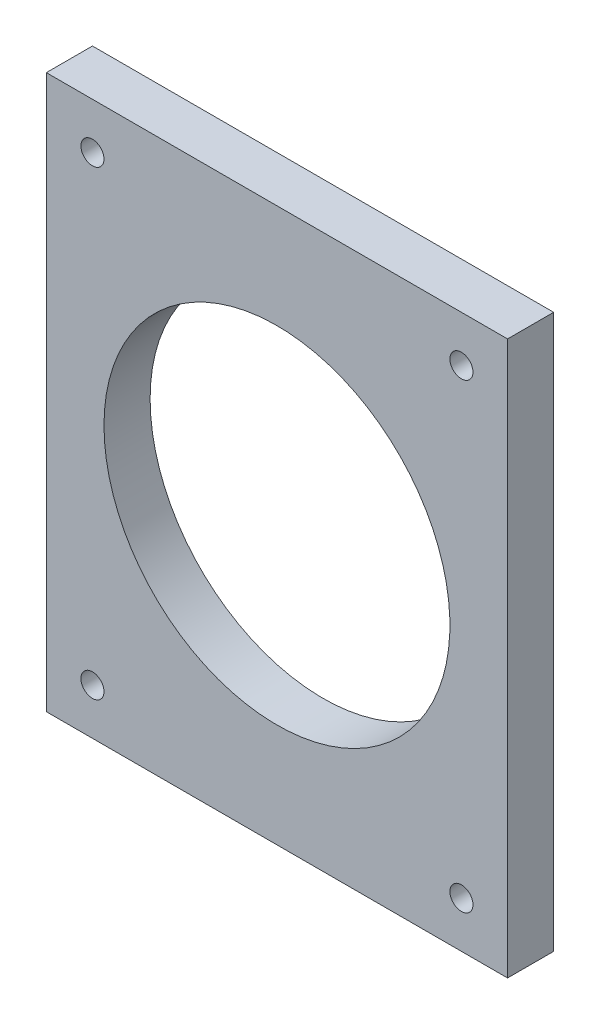
ISO-10303-21;
HEADER;
FILE_DESCRIPTION(('STEP AP214'),'2;1');
FILE_NAME('part.step','',(''),(''),'','','');
FILE_SCHEMA(('AUTOMOTIVE_DESIGN { 1 0 10303 214 1 1 1 1 }'));
ENDSEC;
DATA;
#1=APPLICATION_CONTEXT('core data for automotive mechanical design processes');
#2=APPLICATION_PROTOCOL_DEFINITION('international standard','automotive_design',2000,#1);
#3=PRODUCT_CONTEXT('',#1,'mechanical');
#4=PRODUCT('Part','Part','',(#3));
#5=PRODUCT_RELATED_PRODUCT_CATEGORY('part','',(#4));
#6=PRODUCT_DEFINITION_FORMATION('','',#4);
#7=PRODUCT_DEFINITION_CONTEXT('part definition',#1,'design');
#8=PRODUCT_DEFINITION('design','',#6,#7);
#9=PRODUCT_DEFINITION_SHAPE('','',#8);
#10=(LENGTH_UNIT() NAMED_UNIT(*) SI_UNIT(.MILLI.,.METRE.));
#11=(NAMED_UNIT(*) PLANE_ANGLE_UNIT() SI_UNIT($,.RADIAN.));
#12=(NAMED_UNIT(*) SI_UNIT($,.STERADIAN.) SOLID_ANGLE_UNIT());
#13=UNCERTAINTY_MEASURE_WITH_UNIT(LENGTH_MEASURE(1.E-05),#10,'distance_accuracy_value','');
#14=(GEOMETRIC_REPRESENTATION_CONTEXT(3) GLOBAL_UNCERTAINTY_ASSIGNED_CONTEXT((#13)) GLOBAL_UNIT_ASSIGNED_CONTEXT((#10,
#11,#12)) REPRESENTATION_CONTEXT('',''));
#15=CARTESIAN_POINT('',(0.,0.,0.));
#16=DIRECTION('',(0.,0.,1.));
#17=DIRECTION('',(1.,0.,0.));
#18=AXIS2_PLACEMENT_3D('',#15,#16,#17);
#19=CARTESIAN_POINT('',(-63.4999999999999,-76.1999999999999,12.6999999999999));
#20=DIRECTION('',(1.,0.,0.));
#21=DIRECTION('',(0.,0.,-1.));
#22=AXIS2_PLACEMENT_3D('',#19,#20,#21);
#23=PLANE('',#22);
#24=DIRECTION('',(0.,-1.,0.));
#25=VECTOR('',#24,1.);
#26=CARTESIAN_POINT('',(-63.5000000000001,-76.2,-1.38777878078145E-13));
#27=LINE('',#26,#25);
#28=CARTESIAN_POINT('',(-63.4999999999999,76.2,0.));
#29=VERTEX_POINT('',#28);
#30=CARTESIAN_POINT('',(-63.5000000000001,-76.2,-1.38777878078145E-13));
#31=VERTEX_POINT('',#30);
#32=EDGE_CURVE('E100',#29,#31,#27,.T.);
#33=ORIENTED_EDGE('',*,*,#32,.T.);
#34=DIRECTION('',(0.,0.,-1.));
#35=VECTOR('',#34,1.);
#36=CARTESIAN_POINT('',(-63.4999999999999,-76.1999999999999,12.6999999999999));
#37=LINE('',#36,#35);
#38=CARTESIAN_POINT('',(-63.4999999999999,-76.1999999999999,12.6999999999999));
#39=VERTEX_POINT('',#38);
#40=EDGE_CURVE('E11',#39,#31,#37,.T.);
#41=ORIENTED_EDGE('',*,*,#40,.F.);
#42=DIRECTION('',(0.,-1.,0.));
#43=VECTOR('',#42,1.);
#44=CARTESIAN_POINT('',(-63.4999999999999,-76.1999999999999,12.6999999999999));
#45=LINE('',#44,#43);
#46=CARTESIAN_POINT('',(-63.4999999999999,76.2,12.7));
#47=VERTEX_POINT('',#46);
#48=EDGE_CURVE('E87',#47,#39,#45,.T.);
#49=ORIENTED_EDGE('',*,*,#48,.F.);
#50=DIRECTION('',(0.,0.,-1.));
#51=VECTOR('',#50,1.);
#52=CARTESIAN_POINT('',(-63.4999999999999,76.2,12.7));
#53=LINE('',#52,#51);
#54=EDGE_CURVE('E96',#47,#29,#53,.T.);
#55=ORIENTED_EDGE('',*,*,#54,.T.);
#56=EDGE_LOOP('',(#33,#41,#49,#55));
#57=FACE_BOUND('',#56,.T.);
#58=ADVANCED_FACE('F34',(#57),#23,.F.);
#59=CARTESIAN_POINT('',(63.5,-76.2,12.7));
#60=DIRECTION('',(0.,1.,0.));
#61=DIRECTION('',(0.,0.,1.));
#62=AXIS2_PLACEMENT_3D('',#59,#60,#61);
#63=PLANE('',#62);
#64=DIRECTION('',(1.,0.,0.));
#65=VECTOR('',#64,1.);
#66=CARTESIAN_POINT('',(63.5,-76.2,0.));
#67=LINE('',#66,#65);
#68=CARTESIAN_POINT('',(63.5,-76.2,0.));
#69=VERTEX_POINT('',#68);
#70=EDGE_CURVE('E91',#31,#69,#67,.T.);
#71=ORIENTED_EDGE('',*,*,#70,.T.);
#72=DIRECTION('',(0.,0.,-1.));
#73=VECTOR('',#72,1.);
#74=CARTESIAN_POINT('',(63.5,-76.2,12.7));
#75=LINE('',#74,#73);
#76=CARTESIAN_POINT('',(63.5,-76.2,12.7));
#77=VERTEX_POINT('',#76);
#78=EDGE_CURVE('E43',#77,#69,#75,.T.);
#79=ORIENTED_EDGE('',*,*,#78,.F.);
#80=DIRECTION('',(1.,0.,0.));
#81=VECTOR('',#80,1.);
#82=CARTESIAN_POINT('',(63.5,-76.2,12.7));
#83=LINE('',#82,#81);
#84=EDGE_CURVE('E82',#39,#77,#83,.T.);
#85=ORIENTED_EDGE('',*,*,#84,.F.);
#86=ORIENTED_EDGE('',*,*,#40,.T.);
#87=EDGE_LOOP('',(#71,#79,#85,#86));
#88=FACE_BOUND('',#87,.T.);
#89=ADVANCED_FACE('F90',(#88),#63,.F.);
#90=CARTESIAN_POINT('',(63.5,-76.2,12.7));
#91=DIRECTION('',(-1.,0.,0.));
#92=DIRECTION('',(0.,0.,1.));
#93=AXIS2_PLACEMENT_3D('',#90,#91,#92);
#94=PLANE('',#93);
#95=DIRECTION('',(0.,1.,0.));
#96=VECTOR('',#95,1.);
#97=CARTESIAN_POINT('',(63.5,-76.2,0.));
#98=LINE('',#97,#96);
#99=CARTESIAN_POINT('',(63.5,76.2,0.));
#100=VERTEX_POINT('',#99);
#101=EDGE_CURVE('E69',#69,#100,#98,.T.);
#102=ORIENTED_EDGE('',*,*,#101,.T.);
#103=DIRECTION('',(0.,0.,-1.));
#104=VECTOR('',#103,1.);
#105=CARTESIAN_POINT('',(63.5,76.2,12.7));
#106=LINE('',#105,#104);
#107=CARTESIAN_POINT('',(63.5,76.2,12.7));
#108=VERTEX_POINT('',#107);
#109=EDGE_CURVE('E92',#108,#100,#106,.T.);
#110=ORIENTED_EDGE('',*,*,#109,.F.);
#111=DIRECTION('',(0.,1.,0.));
#112=VECTOR('',#111,1.);
#113=CARTESIAN_POINT('',(63.5,-76.2,12.7));
#114=LINE('',#113,#112);
#115=EDGE_CURVE('E85',#77,#108,#114,.T.);
#116=ORIENTED_EDGE('',*,*,#115,.F.);
#117=ORIENTED_EDGE('',*,*,#78,.T.);
#118=EDGE_LOOP('',(#102,#110,#116,#117));
#119=FACE_BOUND('',#118,.T.);
#120=ADVANCED_FACE('F94',(#119),#94,.F.);
#121=CARTESIAN_POINT('',(63.5,76.2,12.7));
#122=DIRECTION('',(0.,-1.,0.));
#123=DIRECTION('',(0.,0.,-1.));
#124=AXIS2_PLACEMENT_3D('',#121,#122,#123);
#125=PLANE('',#124);
#126=DIRECTION('',(-1.,0.,0.));
#127=VECTOR('',#126,1.);
#128=CARTESIAN_POINT('',(63.5,76.2,0.));
#129=LINE('',#128,#127);
#130=EDGE_CURVE('E75',#100,#29,#129,.T.);
#131=ORIENTED_EDGE('',*,*,#130,.T.);
#132=ORIENTED_EDGE('',*,*,#54,.F.);
#133=DIRECTION('',(-1.,0.,0.));
#134=VECTOR('',#133,1.);
#135=CARTESIAN_POINT('',(63.5,76.2,12.7));
#136=LINE('',#135,#134);
#137=EDGE_CURVE('E52',#108,#47,#136,.T.);
#138=ORIENTED_EDGE('',*,*,#137,.F.);
#139=ORIENTED_EDGE('',*,*,#109,.T.);
#140=EDGE_LOOP('',(#131,#132,#138,#139));
#141=FACE_BOUND('',#140,.T.);
#142=ADVANCED_FACE('F162',(#141),#125,.F.);
#143=CARTESIAN_POINT('',(0.,0.,12.7));
#144=DIRECTION('',(0.,0.,1.));
#145=DIRECTION('',(1.,0.,0.));
#146=AXIS2_PLACEMENT_3D('',#143,#144,#145);
#147=PLANE('',#146);
#148=CARTESIAN_POINT('',(50.8000000000001,-63.5,12.7));
#149=DIRECTION('',(0.,0.,-1.));
#150=DIRECTION('',(-1.,0.,0.));
#151=AXIS2_PLACEMENT_3D('',#148,#149,#150);
#152=CIRCLE('',#151,3.175);
#153=CARTESIAN_POINT('',(47.6250000000001,-63.5,12.7));
#154=VERTEX_POINT('',#153);
#155=EDGE_CURVE('E133',#154,#154,#152,.T.);
#156=ORIENTED_EDGE('',*,*,#155,.T.);
#157=EDGE_LOOP('',(#156));
#158=FACE_BOUND('',#157,.T.);
#159=CARTESIAN_POINT('',(-50.8,-63.5,12.7));
#160=DIRECTION('',(0.,0.,-1.));
#161=DIRECTION('',(-1.,0.,0.));
#162=AXIS2_PLACEMENT_3D('',#159,#160,#161);
#163=CIRCLE('',#162,3.175);
#164=CARTESIAN_POINT('',(-53.975,-63.5,12.7));
#165=VERTEX_POINT('',#164);
#166=EDGE_CURVE('E136',#165,#165,#163,.T.);
#167=ORIENTED_EDGE('',*,*,#166,.T.);
#168=EDGE_LOOP('',(#167));
#169=FACE_BOUND('',#168,.T.);
#170=CARTESIAN_POINT('',(-50.8,63.5,12.7));
#171=DIRECTION('',(0.,0.,-1.));
#172=DIRECTION('',(-1.,0.,0.));
#173=AXIS2_PLACEMENT_3D('',#170,#171,#172);
#174=CIRCLE('',#173,3.175);
#175=CARTESIAN_POINT('',(-53.975,63.5,12.7));
#176=VERTEX_POINT('',#175);
#177=EDGE_CURVE('E132',#176,#176,#174,.T.);
#178=ORIENTED_EDGE('',*,*,#177,.T.);
#179=EDGE_LOOP('',(#178));
#180=FACE_BOUND('',#179,.T.);
#181=CARTESIAN_POINT('',(50.8000000000001,63.5,12.7));
#182=DIRECTION('',(0.,0.,-1.));
#183=DIRECTION('',(-1.,0.,0.));
#184=AXIS2_PLACEMENT_3D('',#181,#182,#183);
#185=CIRCLE('',#184,3.175);
#186=CARTESIAN_POINT('',(47.6250000000001,63.5,12.7));
#187=VERTEX_POINT('',#186);
#188=EDGE_CURVE('E113',#187,#187,#185,.T.);
#189=ORIENTED_EDGE('',*,*,#188,.T.);
#190=EDGE_LOOP('',(#189));
#191=FACE_BOUND('',#190,.T.);
#192=CARTESIAN_POINT('',(0.,0.,12.7));
#193=DIRECTION('',(0.,0.,-1.));
#194=DIRECTION('',(-1.,0.,0.));
#195=AXIS2_PLACEMENT_3D('',#192,#193,#194);
#196=CIRCLE('',#195,47.625);
#197=CARTESIAN_POINT('',(-47.625,0.,12.7));
#198=VERTEX_POINT('',#197);
#199=EDGE_CURVE('E103',#198,#198,#196,.T.);
#200=ORIENTED_EDGE('',*,*,#199,.T.);
#201=EDGE_LOOP('',(#200));
#202=FACE_BOUND('',#201,.T.);
#203=ORIENTED_EDGE('',*,*,#48,.T.);
#204=ORIENTED_EDGE('',*,*,#84,.T.);
#205=ORIENTED_EDGE('',*,*,#115,.T.);
#206=ORIENTED_EDGE('',*,*,#137,.T.);
#207=EDGE_LOOP('',(#203,#204,#205,#206));
#208=FACE_BOUND('',#207,.T.);
#209=ADVANCED_FACE('F83',(#158,#169,#180,#191,#202,#208),#147,.T.);
#210=CARTESIAN_POINT('',(0.,0.,0.));
#211=DIRECTION('',(0.,0.,1.));
#212=DIRECTION('',(1.,0.,0.));
#213=AXIS2_PLACEMENT_3D('',#210,#211,#212);
#214=PLANE('',#213);
#215=CARTESIAN_POINT('',(50.8000000000001,-63.5,0.));
#216=DIRECTION('',(0.,0.,1.));
#217=DIRECTION('',(1.,0.,0.));
#218=AXIS2_PLACEMENT_3D('',#215,#216,#217);
#219=CIRCLE('',#218,3.175);
#220=CARTESIAN_POINT('',(53.9750000000001,-63.5,0.));
#221=VERTEX_POINT('',#220);
#222=EDGE_CURVE('E37',#221,#221,#219,.T.);
#223=ORIENTED_EDGE('',*,*,#222,.T.);
#224=EDGE_LOOP('',(#223));
#225=FACE_BOUND('',#224,.T.);
#226=CARTESIAN_POINT('',(-50.8,-63.5,0.));
#227=DIRECTION('',(0.,0.,1.));
#228=DIRECTION('',(1.,0.,0.));
#229=AXIS2_PLACEMENT_3D('',#226,#227,#228);
#230=CIRCLE('',#229,3.175);
#231=CARTESIAN_POINT('',(-47.625,-63.5,0.));
#232=VERTEX_POINT('',#231);
#233=EDGE_CURVE('E115',#232,#232,#230,.T.);
#234=ORIENTED_EDGE('',*,*,#233,.T.);
#235=EDGE_LOOP('',(#234));
#236=FACE_BOUND('',#235,.T.);
#237=CARTESIAN_POINT('',(-50.8,63.5,0.));
#238=DIRECTION('',(0.,0.,1.));
#239=DIRECTION('',(1.,0.,0.));
#240=AXIS2_PLACEMENT_3D('',#237,#238,#239);
#241=CIRCLE('',#240,3.175);
#242=CARTESIAN_POINT('',(-47.625,63.5,0.));
#243=VERTEX_POINT('',#242);
#244=EDGE_CURVE('E112',#243,#243,#241,.T.);
#245=ORIENTED_EDGE('',*,*,#244,.T.);
#246=EDGE_LOOP('',(#245));
#247=FACE_BOUND('',#246,.T.);
#248=CARTESIAN_POINT('',(50.8000000000001,63.5,0.));
#249=DIRECTION('',(0.,0.,1.));
#250=DIRECTION('',(1.,0.,0.));
#251=AXIS2_PLACEMENT_3D('',#248,#249,#250);
#252=CIRCLE('',#251,3.175);
#253=CARTESIAN_POINT('',(53.9750000000001,63.5,0.));
#254=VERTEX_POINT('',#253);
#255=EDGE_CURVE('E109',#254,#254,#252,.T.);
#256=ORIENTED_EDGE('',*,*,#255,.T.);
#257=EDGE_LOOP('',(#256));
#258=FACE_BOUND('',#257,.T.);
#259=CARTESIAN_POINT('',(0.,0.,0.));
#260=DIRECTION('',(0.,0.,-1.));
#261=DIRECTION('',(-1.,0.,0.));
#262=AXIS2_PLACEMENT_3D('',#259,#260,#261);
#263=CIRCLE('',#262,47.625);
#264=CARTESIAN_POINT('',(-47.625,0.,0.));
#265=VERTEX_POINT('',#264);
#266=EDGE_CURVE('E120',#265,#265,#263,.T.);
#267=ORIENTED_EDGE('',*,*,#266,.F.);
#268=EDGE_LOOP('',(#267));
#269=FACE_BOUND('',#268,.T.);
#270=ORIENTED_EDGE('',*,*,#32,.F.);
#271=ORIENTED_EDGE('',*,*,#130,.F.);
#272=ORIENTED_EDGE('',*,*,#101,.F.);
#273=ORIENTED_EDGE('',*,*,#70,.F.);
#274=EDGE_LOOP('',(#270,#271,#272,#273));
#275=FACE_BOUND('',#274,.T.);
#276=ADVANCED_FACE('F152',(#225,#236,#247,#258,#269,#275),#214,.F.);
#277=CARTESIAN_POINT('',(0.,0.,12.7));
#278=DIRECTION('',(0.,0.,-1.));
#279=DIRECTION('',(-1.,0.,0.));
#280=AXIS2_PLACEMENT_3D('',#277,#278,#279);
#281=CYLINDRICAL_SURFACE('',#280,47.625);
#282=ORIENTED_EDGE('',*,*,#199,.F.);
#283=EDGE_LOOP('',(#282));
#284=FACE_BOUND('',#283,.T.);
#285=ORIENTED_EDGE('',*,*,#266,.T.);
#286=EDGE_LOOP('',(#285));
#287=FACE_BOUND('',#286,.T.);
#288=ADVANCED_FACE('F155',(#284,#287),#281,.F.);
#289=CARTESIAN_POINT('',(50.8000000000001,63.5,12.7));
#290=DIRECTION('',(0.,0.,-1.));
#291=DIRECTION('',(-1.,0.,0.));
#292=AXIS2_PLACEMENT_3D('',#289,#290,#291);
#293=CYLINDRICAL_SURFACE('',#292,3.175);
#294=ORIENTED_EDGE('',*,*,#188,.F.);
#295=EDGE_LOOP('',(#294));
#296=FACE_BOUND('',#295,.T.);
#297=ORIENTED_EDGE('',*,*,#255,.F.);
#298=EDGE_LOOP('',(#297));
#299=FACE_BOUND('',#298,.T.);
#300=ADVANCED_FACE('F148',(#296,#299),#293,.F.);
#301=CARTESIAN_POINT('',(-50.8,63.5,12.7));
#302=DIRECTION('',(0.,0.,-1.));
#303=DIRECTION('',(-1.,0.,0.));
#304=AXIS2_PLACEMENT_3D('',#301,#302,#303);
#305=CYLINDRICAL_SURFACE('',#304,3.175);
#306=ORIENTED_EDGE('',*,*,#177,.F.);
#307=EDGE_LOOP('',(#306));
#308=FACE_BOUND('',#307,.T.);
#309=ORIENTED_EDGE('',*,*,#244,.F.);
#310=EDGE_LOOP('',(#309));
#311=FACE_BOUND('',#310,.T.);
#312=ADVANCED_FACE('F144',(#308,#311),#305,.F.);
#313=CARTESIAN_POINT('',(-50.8,-63.5,12.7));
#314=DIRECTION('',(0.,0.,-1.));
#315=DIRECTION('',(-1.,0.,0.));
#316=AXIS2_PLACEMENT_3D('',#313,#314,#315);
#317=CYLINDRICAL_SURFACE('',#316,3.175);
#318=ORIENTED_EDGE('',*,*,#166,.F.);
#319=EDGE_LOOP('',(#318));
#320=FACE_BOUND('',#319,.T.);
#321=ORIENTED_EDGE('',*,*,#233,.F.);
#322=EDGE_LOOP('',(#321));
#323=FACE_BOUND('',#322,.T.);
#324=ADVANCED_FACE('F147',(#320,#323),#317,.F.);
#325=CARTESIAN_POINT('',(50.8000000000001,-63.5,12.7));
#326=DIRECTION('',(0.,0.,-1.));
#327=DIRECTION('',(-1.,0.,0.));
#328=AXIS2_PLACEMENT_3D('',#325,#326,#327);
#329=CYLINDRICAL_SURFACE('',#328,3.175);
#330=ORIENTED_EDGE('',*,*,#155,.F.);
#331=EDGE_LOOP('',(#330));
#332=FACE_BOUND('',#331,.T.);
#333=ORIENTED_EDGE('',*,*,#222,.F.);
#334=EDGE_LOOP('',(#333));
#335=FACE_BOUND('',#334,.T.);
#336=ADVANCED_FACE('F217',(#332,#335),#329,.F.);
#337=CLOSED_SHELL('',(#58,#89,#120,#142,#209,#276,#288,#300,#312,#324,#336));
#338=MANIFOLD_SOLID_BREP('B2',#337);
#339=ADVANCED_BREP_SHAPE_REPRESENTATION('',(#18,#338),#14);
#340=SHAPE_DEFINITION_REPRESENTATION(#9,#339);
ENDSEC;
END-ISO-10303-21;
